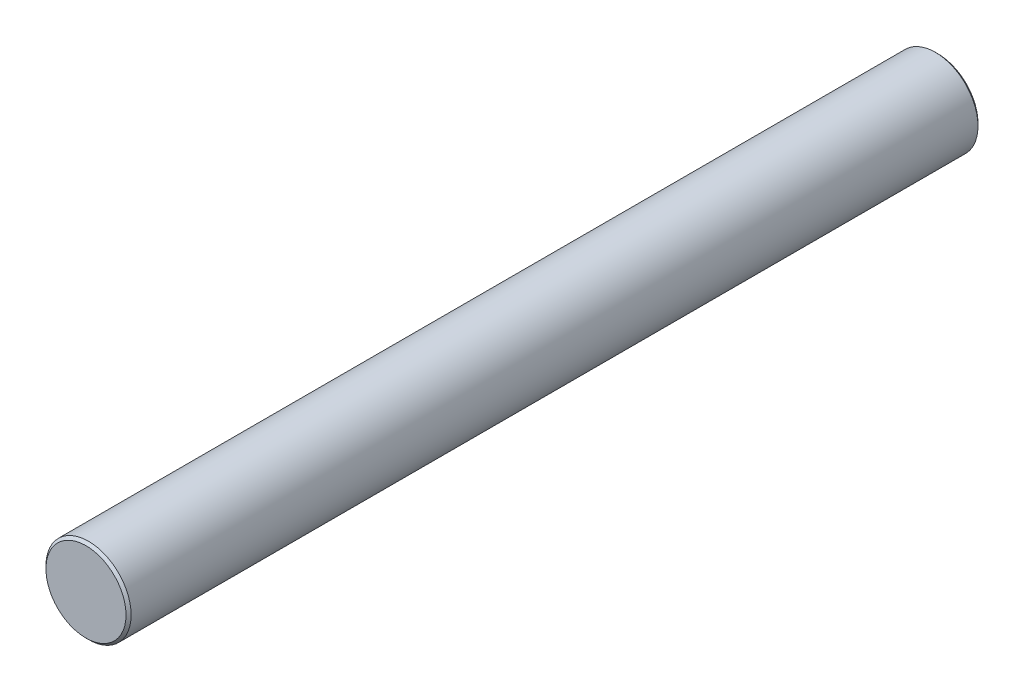
ISO-10303-21;
HEADER;
FILE_DESCRIPTION(('STEP AP214'),'2;1');
FILE_NAME('part.step','',(''),(''),'','','');
FILE_SCHEMA(('AUTOMOTIVE_DESIGN { 1 0 10303 214 1 1 1 1 }'));
ENDSEC;
DATA;
#1=APPLICATION_CONTEXT('core data for automotive mechanical design processes');
#2=APPLICATION_PROTOCOL_DEFINITION('international standard','automotive_design',2000,#1);
#3=PRODUCT_CONTEXT('',#1,'mechanical');
#4=PRODUCT('Part','Part','',(#3));
#5=PRODUCT_RELATED_PRODUCT_CATEGORY('part','',(#4));
#6=PRODUCT_DEFINITION_FORMATION('','',#4);
#7=PRODUCT_DEFINITION_CONTEXT('part definition',#1,'design');
#8=PRODUCT_DEFINITION('design','',#6,#7);
#9=PRODUCT_DEFINITION_SHAPE('','',#8);
#10=(LENGTH_UNIT() NAMED_UNIT(*) SI_UNIT(.MILLI.,.METRE.));
#11=(NAMED_UNIT(*) PLANE_ANGLE_UNIT() SI_UNIT($,.RADIAN.));
#12=(NAMED_UNIT(*) SI_UNIT($,.STERADIAN.) SOLID_ANGLE_UNIT());
#13=UNCERTAINTY_MEASURE_WITH_UNIT(LENGTH_MEASURE(1.E-05),#10,'distance_accuracy_value','');
#14=(GEOMETRIC_REPRESENTATION_CONTEXT(3) GLOBAL_UNCERTAINTY_ASSIGNED_CONTEXT((#13)) GLOBAL_UNIT_ASSIGNED_CONTEXT((#10,
#11,#12)) REPRESENTATION_CONTEXT('',''));
#15=CARTESIAN_POINT('',(0.,0.,0.));
#16=DIRECTION('',(0.,0.,1.));
#17=DIRECTION('',(1.,0.,0.));
#18=AXIS2_PLACEMENT_3D('',#15,#16,#17);
#19=CARTESIAN_POINT('',(0.,0.,50.));
#20=DIRECTION('',(0.,0.,-1.));
#21=DIRECTION('',(-1.,0.,0.));
#22=AXIS2_PLACEMENT_3D('',#19,#20,#21);
#23=CYLINDRICAL_SURFACE('',#22,5.);
#24=CARTESIAN_POINT('',(0.,0.,-49.7));
#25=DIRECTION('',(0.,0.,1.));
#26=DIRECTION('',(1.,0.,0.));
#27=AXIS2_PLACEMENT_3D('',#24,#25,#26);
#28=CIRCLE('',#27,5.);
#29=CARTESIAN_POINT('',(5.,0.,-49.7));
#30=VERTEX_POINT('',#29);
#31=EDGE_CURVE('E53',#30,#30,#28,.T.);
#32=ORIENTED_EDGE('',*,*,#31,.T.);
#33=EDGE_LOOP('',(#32));
#34=FACE_BOUND('',#33,.T.);
#35=CARTESIAN_POINT('',(0.,0.,49.7));
#36=DIRECTION('',(0.,0.,1.));
#37=DIRECTION('',(1.,0.,0.));
#38=AXIS2_PLACEMENT_3D('',#35,#36,#37);
#39=CIRCLE('',#38,5.);
#40=CARTESIAN_POINT('',(5.,0.,49.7));
#41=VERTEX_POINT('',#40);
#42=EDGE_CURVE('E58',#41,#41,#39,.F.);
#43=ORIENTED_EDGE('',*,*,#42,.T.);
#44=EDGE_LOOP('',(#43));
#45=FACE_BOUND('',#44,.T.);
#46=ADVANCED_FACE('F39',(#34,#45),#23,.T.);
#47=CARTESIAN_POINT('',(0.,0.,50.));
#48=DIRECTION('',(0.,0.,1.));
#49=DIRECTION('',(1.,0.,0.));
#50=AXIS2_PLACEMENT_3D('',#47,#48,#49);
#51=PLANE('',#50);
#52=CARTESIAN_POINT('',(0.,0.,50.));
#53=DIRECTION('',(0.,0.,1.));
#54=DIRECTION('',(1.,0.,0.));
#55=AXIS2_PLACEMENT_3D('',#52,#53,#54);
#56=CIRCLE('',#55,4.7);
#57=CARTESIAN_POINT('',(4.7,0.,50.));
#58=VERTEX_POINT('',#57);
#59=EDGE_CURVE('E10',#58,#58,#56,.T.);
#60=ORIENTED_EDGE('',*,*,#59,.T.);
#61=EDGE_LOOP('',(#60));
#62=FACE_BOUND('',#61,.T.);
#63=ADVANCED_FACE('F75',(#62),#51,.T.);
#64=CARTESIAN_POINT('',(0.,0.,-50.));
#65=DIRECTION('',(0.,0.,1.));
#66=DIRECTION('',(1.,0.,0.));
#67=AXIS2_PLACEMENT_3D('',#64,#65,#66);
#68=PLANE('',#67);
#69=CARTESIAN_POINT('',(0.,0.,-50.));
#70=DIRECTION('',(0.,0.,1.));
#71=DIRECTION('',(1.,0.,0.));
#72=AXIS2_PLACEMENT_3D('',#69,#70,#71);
#73=CIRCLE('',#72,4.69999999999998);
#74=CARTESIAN_POINT('',(4.69999999999998,0.,-50.));
#75=VERTEX_POINT('',#74);
#76=EDGE_CURVE('E48',#75,#75,#73,.F.);
#77=ORIENTED_EDGE('',*,*,#76,.T.);
#78=EDGE_LOOP('',(#77));
#79=FACE_BOUND('',#78,.T.);
#80=ADVANCED_FACE('F72',(#79),#68,.F.);
#81=CARTESIAN_POINT('',(0.,0.,-49.7));
#82=DIRECTION('',(0.,0.,1.));
#83=DIRECTION('',(1.,0.,0.));
#84=AXIS2_PLACEMENT_3D('',#81,#82,#83);
#85=CONICAL_SURFACE('',#84,5.,0.785398163397464);
#86=ORIENTED_EDGE('',*,*,#76,.F.);
#87=EDGE_LOOP('',(#86));
#88=FACE_BOUND('',#87,.T.);
#89=ORIENTED_EDGE('',*,*,#31,.F.);
#90=EDGE_LOOP('',(#89));
#91=FACE_BOUND('',#90,.T.);
#92=ADVANCED_FACE('F68',(#88,#91),#85,.T.);
#93=CARTESIAN_POINT('',(0.,0.,50.));
#94=DIRECTION('',(0.,0.,-1.));
#95=DIRECTION('',(-1.,0.,0.));
#96=AXIS2_PLACEMENT_3D('',#93,#94,#95);
#97=CONICAL_SURFACE('',#96,4.7,0.785398163397453);
#98=ORIENTED_EDGE('',*,*,#42,.F.);
#99=EDGE_LOOP('',(#98));
#100=FACE_BOUND('',#99,.T.);
#101=ORIENTED_EDGE('',*,*,#59,.F.);
#102=EDGE_LOOP('',(#101));
#103=FACE_BOUND('',#102,.T.);
#104=ADVANCED_FACE('F42',(#100,#103),#97,.T.);
#105=CLOSED_SHELL('',(#46,#63,#80,#92,#104));
#106=MANIFOLD_SOLID_BREP('B2',#105);
#107=ADVANCED_BREP_SHAPE_REPRESENTATION('',(#18,#106),#14);
#108=SHAPE_DEFINITION_REPRESENTATION(#9,#107);
ENDSEC;
END-ISO-10303-21;
